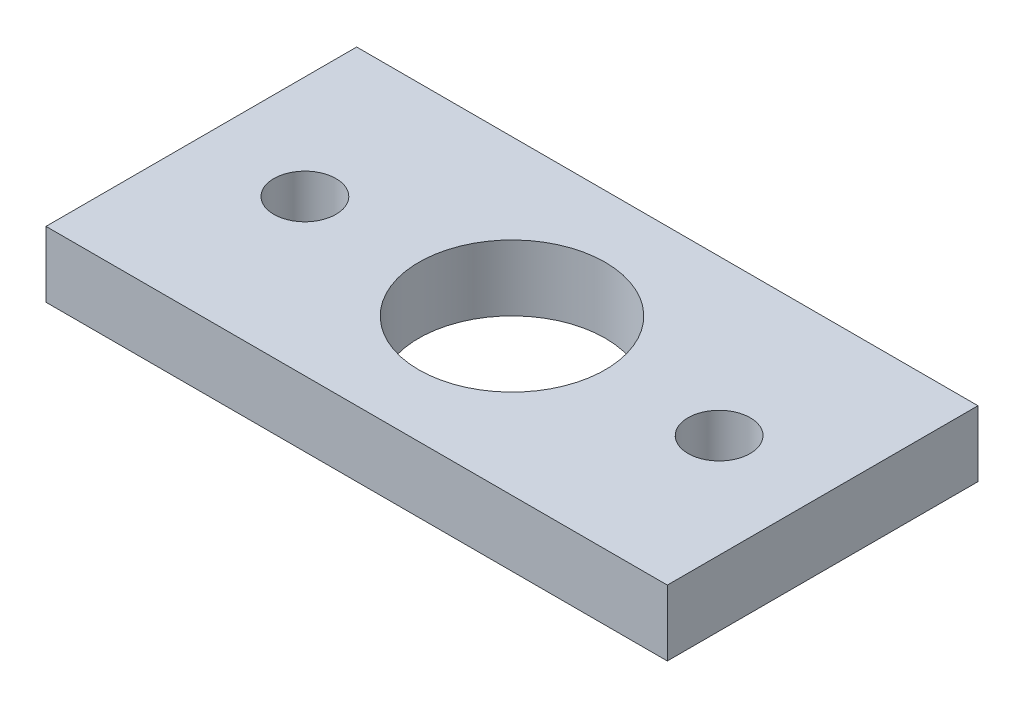
ISO-10303-21;
HEADER;
FILE_DESCRIPTION(('STEP AP214'),'2;1');
FILE_NAME('part.step','',(''),(''),'','','');
FILE_SCHEMA(('AUTOMOTIVE_DESIGN { 1 0 10303 214 1 1 1 1 }'));
ENDSEC;
DATA;
#1=APPLICATION_CONTEXT('core data for automotive mechanical design processes');
#2=APPLICATION_PROTOCOL_DEFINITION('international standard','automotive_design',2000,#1);
#3=PRODUCT_CONTEXT('',#1,'mechanical');
#4=PRODUCT('Part','Part','',(#3));
#5=PRODUCT_RELATED_PRODUCT_CATEGORY('part','',(#4));
#6=PRODUCT_DEFINITION_FORMATION('','',#4);
#7=PRODUCT_DEFINITION_CONTEXT('part definition',#1,'design');
#8=PRODUCT_DEFINITION('design','',#6,#7);
#9=PRODUCT_DEFINITION_SHAPE('','',#8);
#10=(LENGTH_UNIT() NAMED_UNIT(*) SI_UNIT(.MILLI.,.METRE.));
#11=(NAMED_UNIT(*) PLANE_ANGLE_UNIT() SI_UNIT($,.RADIAN.));
#12=(NAMED_UNIT(*) SI_UNIT($,.STERADIAN.) SOLID_ANGLE_UNIT());
#13=UNCERTAINTY_MEASURE_WITH_UNIT(LENGTH_MEASURE(1.E-05),#10,'distance_accuracy_value','');
#14=(GEOMETRIC_REPRESENTATION_CONTEXT(3) GLOBAL_UNCERTAINTY_ASSIGNED_CONTEXT((#13)) GLOBAL_UNIT_ASSIGNED_CONTEXT((#10,
#11,#12)) REPRESENTATION_CONTEXT('',''));
#15=CARTESIAN_POINT('',(0.,0.,0.));
#16=DIRECTION('',(0.,0.,1.));
#17=DIRECTION('',(1.,0.,0.));
#18=AXIS2_PLACEMENT_3D('',#15,#16,#17);
#19=CARTESIAN_POINT('',(0.,3.175,0.));
#20=DIRECTION('',(0.,0.,-1.));
#21=DIRECTION('',(-1.,0.,0.));
#22=AXIS2_PLACEMENT_3D('',#19,#20,#21);
#23=PLANE('',#22);
#24=DIRECTION('',(1.,0.,0.));
#25=VECTOR('',#24,1.);
#26=CARTESIAN_POINT('',(0.,0.,0.));
#27=LINE('',#26,#25);
#28=CARTESIAN_POINT('',(0.,0.,0.));
#29=VERTEX_POINT('',#28);
#30=CARTESIAN_POINT('',(30.,0.,0.));
#31=VERTEX_POINT('',#30);
#32=EDGE_CURVE('E108',#29,#31,#27,.T.);
#33=ORIENTED_EDGE('',*,*,#32,.T.);
#34=DIRECTION('',(0.,-1.,0.));
#35=VECTOR('',#34,1.);
#36=CARTESIAN_POINT('',(30.,3.175,0.));
#37=LINE('',#36,#35);
#38=CARTESIAN_POINT('',(30.,3.175,0.));
#39=VERTEX_POINT('',#38);
#40=EDGE_CURVE('E11',#39,#31,#37,.T.);
#41=ORIENTED_EDGE('',*,*,#40,.F.);
#42=DIRECTION('',(1.,0.,0.));
#43=VECTOR('',#42,1.);
#44=CARTESIAN_POINT('',(0.,3.175,0.));
#45=LINE('',#44,#43);
#46=CARTESIAN_POINT('',(0.,3.175,0.));
#47=VERTEX_POINT('',#46);
#48=EDGE_CURVE('E85',#47,#39,#45,.T.);
#49=ORIENTED_EDGE('',*,*,#48,.F.);
#50=DIRECTION('',(0.,-1.,0.));
#51=VECTOR('',#50,1.);
#52=CARTESIAN_POINT('',(0.,3.175,0.));
#53=LINE('',#52,#51);
#54=EDGE_CURVE('E52',#47,#29,#53,.T.);
#55=ORIENTED_EDGE('',*,*,#54,.T.);
#56=EDGE_LOOP('',(#33,#41,#49,#55));
#57=FACE_BOUND('',#56,.T.);
#58=ADVANCED_FACE('F35',(#57),#23,.F.);
#59=CARTESIAN_POINT('',(30.,3.175,0.));
#60=DIRECTION('',(-1.,0.,0.));
#61=DIRECTION('',(0.,0.,1.));
#62=AXIS2_PLACEMENT_3D('',#59,#60,#61);
#63=PLANE('',#62);
#64=DIRECTION('',(0.,0.,-1.));
#65=VECTOR('',#64,1.);
#66=CARTESIAN_POINT('',(30.,0.,0.));
#67=LINE('',#66,#65);
#68=CARTESIAN_POINT('',(30.,0.,-15.));
#69=VERTEX_POINT('',#68);
#70=EDGE_CURVE('E90',#31,#69,#67,.T.);
#71=ORIENTED_EDGE('',*,*,#70,.T.);
#72=DIRECTION('',(0.,-1.,0.));
#73=VECTOR('',#72,1.);
#74=CARTESIAN_POINT('',(30.,3.175,-15.));
#75=LINE('',#74,#73);
#76=CARTESIAN_POINT('',(30.,3.175,-15.));
#77=VERTEX_POINT('',#76);
#78=EDGE_CURVE('E44',#77,#69,#75,.T.);
#79=ORIENTED_EDGE('',*,*,#78,.F.);
#80=DIRECTION('',(0.,0.,-1.));
#81=VECTOR('',#80,1.);
#82=CARTESIAN_POINT('',(30.,3.175,0.));
#83=LINE('',#82,#81);
#84=EDGE_CURVE('E77',#39,#77,#83,.T.);
#85=ORIENTED_EDGE('',*,*,#84,.F.);
#86=ORIENTED_EDGE('',*,*,#40,.T.);
#87=EDGE_LOOP('',(#71,#79,#85,#86));
#88=FACE_BOUND('',#87,.T.);
#89=ADVANCED_FACE('F89',(#88),#63,.F.);
#90=CARTESIAN_POINT('',(0.,3.175,-15.));
#91=DIRECTION('',(0.,0.,-1.));
#92=DIRECTION('',(-1.,0.,0.));
#93=AXIS2_PLACEMENT_3D('',#90,#91,#92);
#94=PLANE('',#93);
#95=DIRECTION('',(1.,0.,0.));
#96=VECTOR('',#95,1.);
#97=CARTESIAN_POINT('',(0.,0.,-15.));
#98=LINE('',#97,#96);
#99=CARTESIAN_POINT('',(0.,0.,-15.));
#100=VERTEX_POINT('',#99);
#101=EDGE_CURVE('E111',#100,#69,#98,.T.);
#102=ORIENTED_EDGE('',*,*,#101,.F.);
#103=DIRECTION('',(0.,-1.,0.));
#104=VECTOR('',#103,1.);
#105=CARTESIAN_POINT('',(0.,3.175,-15.));
#106=LINE('',#105,#104);
#107=CARTESIAN_POINT('',(0.,3.175,-15.));
#108=VERTEX_POINT('',#107);
#109=EDGE_CURVE('E66',#108,#100,#106,.T.);
#110=ORIENTED_EDGE('',*,*,#109,.F.);
#111=DIRECTION('',(1.,0.,0.));
#112=VECTOR('',#111,1.);
#113=CARTESIAN_POINT('',(0.,3.175,-15.));
#114=LINE('',#113,#112);
#115=EDGE_CURVE('E84',#108,#77,#114,.T.);
#116=ORIENTED_EDGE('',*,*,#115,.T.);
#117=ORIENTED_EDGE('',*,*,#78,.T.);
#118=EDGE_LOOP('',(#102,#110,#116,#117));
#119=FACE_BOUND('',#118,.T.);
#120=ADVANCED_FACE('F93',(#119),#94,.T.);
#121=CARTESIAN_POINT('',(15.,3.175,-7.5));
#122=DIRECTION('',(0.,-1.,0.));
#123=DIRECTION('',(0.,0.,-1.));
#124=AXIS2_PLACEMENT_3D('',#121,#122,#123);
#125=CYLINDRICAL_SURFACE('',#124,4.5);
#126=CARTESIAN_POINT('',(15.,3.175,-7.5));
#127=DIRECTION('',(0.,1.,0.));
#128=DIRECTION('',(0.,0.,1.));
#129=AXIS2_PLACEMENT_3D('',#126,#127,#128);
#130=CIRCLE('',#129,4.5);
#131=CARTESIAN_POINT('',(15.,3.175,-2.99999999999999));
#132=VERTEX_POINT('',#131);
#133=EDGE_CURVE('E125',#132,#132,#130,.T.);
#134=ORIENTED_EDGE('',*,*,#133,.T.);
#135=EDGE_LOOP('',(#134));
#136=FACE_BOUND('',#135,.T.);
#137=CARTESIAN_POINT('',(15.,0.,-7.5));
#138=DIRECTION('',(0.,1.,0.));
#139=DIRECTION('',(0.,0.,1.));
#140=AXIS2_PLACEMENT_3D('',#137,#138,#139);
#141=CIRCLE('',#140,4.5);
#142=CARTESIAN_POINT('',(15.,0.,-2.99999999999999));
#143=VERTEX_POINT('',#142);
#144=EDGE_CURVE('E105',#143,#143,#141,.T.);
#145=ORIENTED_EDGE('',*,*,#144,.F.);
#146=EDGE_LOOP('',(#145));
#147=FACE_BOUND('',#146,.T.);
#148=ADVANCED_FACE('F131',(#136,#147),#125,.F.);
#149=CARTESIAN_POINT('',(25.,3.175,-7.5));
#150=DIRECTION('',(0.,-1.,0.));
#151=DIRECTION('',(0.,0.,-1.));
#152=AXIS2_PLACEMENT_3D('',#149,#150,#151);
#153=CYLINDRICAL_SURFACE('',#152,1.5);
#154=CARTESIAN_POINT('',(25.,3.175,-7.5));
#155=DIRECTION('',(0.,1.,0.));
#156=DIRECTION('',(0.,0.,1.));
#157=AXIS2_PLACEMENT_3D('',#154,#155,#156);
#158=CIRCLE('',#157,1.5);
#159=CARTESIAN_POINT('',(25.,3.175,-6.));
#160=VERTEX_POINT('',#159);
#161=EDGE_CURVE('E120',#160,#160,#158,.T.);
#162=ORIENTED_EDGE('',*,*,#161,.T.);
#163=EDGE_LOOP('',(#162));
#164=FACE_BOUND('',#163,.T.);
#165=CARTESIAN_POINT('',(25.,0.,-7.5));
#166=DIRECTION('',(0.,1.,0.));
#167=DIRECTION('',(0.,0.,1.));
#168=AXIS2_PLACEMENT_3D('',#165,#166,#167);
#169=CIRCLE('',#168,1.5);
#170=CARTESIAN_POINT('',(25.,0.,-6.));
#171=VERTEX_POINT('',#170);
#172=EDGE_CURVE('E102',#171,#171,#169,.T.);
#173=ORIENTED_EDGE('',*,*,#172,.F.);
#174=EDGE_LOOP('',(#173));
#175=FACE_BOUND('',#174,.T.);
#176=ADVANCED_FACE('F156',(#164,#175),#153,.F.);
#177=CARTESIAN_POINT('',(5.,3.175,-7.5));
#178=DIRECTION('',(0.,-1.,0.));
#179=DIRECTION('',(0.,0.,-1.));
#180=AXIS2_PLACEMENT_3D('',#177,#178,#179);
#181=CYLINDRICAL_SURFACE('',#180,1.5);
#182=CARTESIAN_POINT('',(5.,3.175,-7.5));
#183=DIRECTION('',(0.,1.,0.));
#184=DIRECTION('',(0.,0.,1.));
#185=AXIS2_PLACEMENT_3D('',#182,#183,#184);
#186=CIRCLE('',#185,1.5);
#187=CARTESIAN_POINT('',(5.,3.175,-6.));
#188=VERTEX_POINT('',#187);
#189=EDGE_CURVE('E116',#188,#188,#186,.T.);
#190=ORIENTED_EDGE('',*,*,#189,.T.);
#191=EDGE_LOOP('',(#190));
#192=FACE_BOUND('',#191,.T.);
#193=CARTESIAN_POINT('',(5.,0.,-7.5));
#194=DIRECTION('',(0.,1.,0.));
#195=DIRECTION('',(0.,0.,1.));
#196=AXIS2_PLACEMENT_3D('',#193,#194,#195);
#197=CIRCLE('',#196,1.5);
#198=CARTESIAN_POINT('',(5.,0.,-6.));
#199=VERTEX_POINT('',#198);
#200=EDGE_CURVE('E99',#199,#199,#197,.T.);
#201=ORIENTED_EDGE('',*,*,#200,.F.);
#202=EDGE_LOOP('',(#201));
#203=FACE_BOUND('',#202,.T.);
#204=ADVANCED_FACE('F37',(#192,#203),#181,.F.);
#205=CARTESIAN_POINT('',(0.,3.175,0.));
#206=DIRECTION('',(-1.,0.,0.));
#207=DIRECTION('',(0.,0.,1.));
#208=AXIS2_PLACEMENT_3D('',#205,#206,#207);
#209=PLANE('',#208);
#210=DIRECTION('',(0.,0.,-1.));
#211=VECTOR('',#210,1.);
#212=CARTESIAN_POINT('',(0.,0.,0.));
#213=LINE('',#212,#211);
#214=EDGE_CURVE('E113',#29,#100,#213,.T.);
#215=ORIENTED_EDGE('',*,*,#214,.F.);
#216=ORIENTED_EDGE('',*,*,#54,.F.);
#217=DIRECTION('',(0.,0.,-1.));
#218=VECTOR('',#217,1.);
#219=CARTESIAN_POINT('',(0.,3.175,0.));
#220=LINE('',#219,#218);
#221=EDGE_CURVE('E94',#47,#108,#220,.T.);
#222=ORIENTED_EDGE('',*,*,#221,.T.);
#223=ORIENTED_EDGE('',*,*,#109,.T.);
#224=EDGE_LOOP('',(#215,#216,#222,#223));
#225=FACE_BOUND('',#224,.T.);
#226=ADVANCED_FACE('F136',(#225),#209,.T.);
#227=CARTESIAN_POINT('',(0.,3.175,0.));
#228=DIRECTION('',(0.,1.,0.));
#229=DIRECTION('',(0.,0.,1.));
#230=AXIS2_PLACEMENT_3D('',#227,#228,#229);
#231=PLANE('',#230);
#232=ORIENTED_EDGE('',*,*,#189,.F.);
#233=EDGE_LOOP('',(#232));
#234=FACE_BOUND('',#233,.T.);
#235=ORIENTED_EDGE('',*,*,#161,.F.);
#236=EDGE_LOOP('',(#235));
#237=FACE_BOUND('',#236,.T.);
#238=ORIENTED_EDGE('',*,*,#133,.F.);
#239=EDGE_LOOP('',(#238));
#240=FACE_BOUND('',#239,.T.);
#241=ORIENTED_EDGE('',*,*,#48,.T.);
#242=ORIENTED_EDGE('',*,*,#84,.T.);
#243=ORIENTED_EDGE('',*,*,#115,.F.);
#244=ORIENTED_EDGE('',*,*,#221,.F.);
#245=EDGE_LOOP('',(#241,#242,#243,#244));
#246=FACE_BOUND('',#245,.T.);
#247=ADVANCED_FACE('F81',(#234,#237,#240,#246),#231,.T.);
#248=CARTESIAN_POINT('',(0.,0.,0.));
#249=DIRECTION('',(0.,1.,0.));
#250=DIRECTION('',(0.,0.,1.));
#251=AXIS2_PLACEMENT_3D('',#248,#249,#250);
#252=PLANE('',#251);
#253=ORIENTED_EDGE('',*,*,#200,.T.);
#254=EDGE_LOOP('',(#253));
#255=FACE_BOUND('',#254,.T.);
#256=ORIENTED_EDGE('',*,*,#172,.T.);
#257=EDGE_LOOP('',(#256));
#258=FACE_BOUND('',#257,.T.);
#259=ORIENTED_EDGE('',*,*,#144,.T.);
#260=EDGE_LOOP('',(#259));
#261=FACE_BOUND('',#260,.T.);
#262=ORIENTED_EDGE('',*,*,#32,.F.);
#263=ORIENTED_EDGE('',*,*,#214,.T.);
#264=ORIENTED_EDGE('',*,*,#101,.T.);
#265=ORIENTED_EDGE('',*,*,#70,.F.);
#266=EDGE_LOOP('',(#262,#263,#264,#265));
#267=FACE_BOUND('',#266,.T.);
#268=ADVANCED_FACE('F135',(#255,#258,#261,#267),#252,.F.);
#269=CLOSED_SHELL('',(#58,#89,#120,#148,#176,#204,#226,#247,#268));
#270=MANIFOLD_SOLID_BREP('B2',#269);
#271=ADVANCED_BREP_SHAPE_REPRESENTATION('',(#18,#270),#14);
#272=SHAPE_DEFINITION_REPRESENTATION(#9,#271);
ENDSEC;
END-ISO-10303-21;
